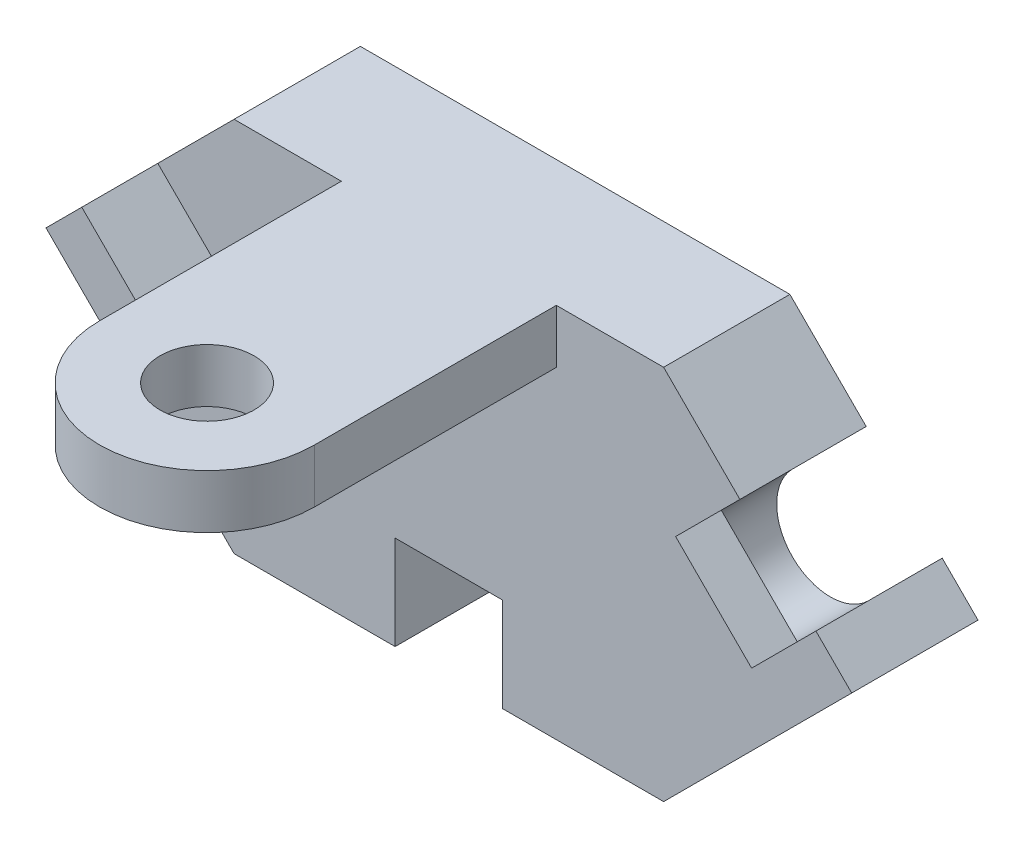
ISO-10303-21;
HEADER;
FILE_DESCRIPTION(('STEP AP214'),'2;1');
FILE_NAME('part.step','',(''),(''),'','','');
FILE_SCHEMA(('AUTOMOTIVE_DESIGN { 1 0 10303 214 1 1 1 1 }'));
ENDSEC;
DATA;
#1=APPLICATION_CONTEXT('core data for automotive mechanical design processes');
#2=APPLICATION_PROTOCOL_DEFINITION('international standard','automotive_design',2000,#1);
#3=PRODUCT_CONTEXT('',#1,'mechanical');
#4=PRODUCT('Part','Part','',(#3));
#5=PRODUCT_RELATED_PRODUCT_CATEGORY('part','',(#4));
#6=PRODUCT_DEFINITION_FORMATION('','',#4);
#7=PRODUCT_DEFINITION_CONTEXT('part definition',#1,'design');
#8=PRODUCT_DEFINITION('design','',#6,#7);
#9=PRODUCT_DEFINITION_SHAPE('','',#8);
#10=(LENGTH_UNIT() NAMED_UNIT(*) SI_UNIT(.MILLI.,.METRE.));
#11=(NAMED_UNIT(*) PLANE_ANGLE_UNIT() SI_UNIT($,.RADIAN.));
#12=(NAMED_UNIT(*) SI_UNIT($,.STERADIAN.) SOLID_ANGLE_UNIT());
#13=UNCERTAINTY_MEASURE_WITH_UNIT(LENGTH_MEASURE(1.E-05),#10,'distance_accuracy_value','');
#14=(GEOMETRIC_REPRESENTATION_CONTEXT(3) GLOBAL_UNCERTAINTY_ASSIGNED_CONTEXT((#13)) GLOBAL_UNIT_ASSIGNED_CONTEXT((#10,
#11,#12)) REPRESENTATION_CONTEXT('',''));
#15=CARTESIAN_POINT('',(0.,0.,0.));
#16=DIRECTION('',(0.,0.,1.));
#17=DIRECTION('',(1.,0.,0.));
#18=AXIS2_PLACEMENT_3D('',#15,#16,#17);
#19=CARTESIAN_POINT('',(7.99288091782957,7.,3.));
#20=DIRECTION('',(0.,-1.,0.));
#21=DIRECTION('',(0.,0.,-1.));
#22=AXIS2_PLACEMENT_3D('',#19,#20,#21);
#23=PLANE('',#22);
#24=DIRECTION('',(-1.,0.,0.));
#25=VECTOR('',#24,1.);
#26=CARTESIAN_POINT('',(7.99288091782957,7.,0.));
#27=LINE('',#26,#25);
#28=CARTESIAN_POINT('',(7.99288091782957,7.,0.));
#29=VERTEX_POINT('',#28);
#30=CARTESIAN_POINT('',(-7.99288091782957,7.,0.));
#31=VERTEX_POINT('',#30);
#32=EDGE_CURVE('E332',#29,#31,#27,.T.);
#33=ORIENTED_EDGE('',*,*,#32,.T.);
#34=DIRECTION('',(0.,0.,-1.));
#35=VECTOR('',#34,1.);
#36=CARTESIAN_POINT('',(-7.99288091782957,7.,3.));
#37=LINE('',#36,#35);
#38=CARTESIAN_POINT('',(-7.99288091782957,7.,4.7));
#39=VERTEX_POINT('',#38);
#40=EDGE_CURVE('E11',#39,#31,#37,.T.);
#41=ORIENTED_EDGE('',*,*,#40,.F.);
#42=DIRECTION('',(-1.,0.,0.));
#43=VECTOR('',#42,1.);
#44=CARTESIAN_POINT('',(7.99288091782957,7.,4.7));
#45=LINE('',#44,#43);
#46=CARTESIAN_POINT('',(-3.99999999999897,7.,4.7));
#47=VERTEX_POINT('',#46);
#48=EDGE_CURVE('E261',#47,#39,#45,.T.);
#49=ORIENTED_EDGE('',*,*,#48,.F.);
#50=DIRECTION('',(-2.29754487040507E-13,0.,1.));
#51=VECTOR('',#50,1.);
#52=CARTESIAN_POINT('',(-4.00000000000103,7.,13.6999999999991));
#53=LINE('',#52,#51);
#54=CARTESIAN_POINT('',(-4.,7.,13.6999999999991));
#55=VERTEX_POINT('',#54);
#56=EDGE_CURVE('E47',#47,#55,#53,.T.);
#57=ORIENTED_EDGE('',*,*,#56,.T.);
#58=CARTESIAN_POINT('',(0.,7.,13.7));
#59=DIRECTION('',(0.,1.,0.));
#60=DIRECTION('',(0.,0.,-1.));
#61=AXIS2_PLACEMENT_3D('',#58,#59,#60);
#62=CIRCLE('',#61,4.);
#63=CARTESIAN_POINT('',(3.99999999999897,7.,13.7));
#64=VERTEX_POINT('',#63);
#65=EDGE_CURVE('E224',#55,#64,#62,.T.);
#66=ORIENTED_EDGE('',*,*,#65,.T.);
#67=DIRECTION('',(2.30139981146256E-13,0.,-1.));
#68=VECTOR('',#67,1.);
#69=CARTESIAN_POINT('',(3.99999999999897,7.,13.7));
#70=LINE('',#69,#68);
#71=CARTESIAN_POINT('',(4.00000000000104,7.,4.7));
#72=VERTEX_POINT('',#71);
#73=EDGE_CURVE('E240',#64,#72,#70,.T.);
#74=ORIENTED_EDGE('',*,*,#73,.T.);
#75=CARTESIAN_POINT('',(7.99288091782957,7.,4.7));
#76=VERTEX_POINT('',#75);
#77=EDGE_CURVE('E263',#76,#72,#45,.T.);
#78=ORIENTED_EDGE('',*,*,#77,.F.);
#79=DIRECTION('',(0.,0.,-1.));
#80=VECTOR('',#79,1.);
#81=CARTESIAN_POINT('',(7.99288091782957,7.,3.));
#82=LINE('',#81,#80);
#83=EDGE_CURVE('E356',#76,#29,#82,.T.);
#84=ORIENTED_EDGE('',*,*,#83,.T.);
#85=EDGE_LOOP('',(#33,#41,#49,#57,#66,#74,#78,#84));
#86=FACE_BOUND('',#85,.T.);
#87=CARTESIAN_POINT('',(0.,7.,13.7));
#88=DIRECTION('',(0.,1.,0.));
#89=DIRECTION('',(0.,0.,-1.));
#90=AXIS2_PLACEMENT_3D('',#87,#88,#89);
#91=CIRCLE('',#90,1.75);
#92=CARTESIAN_POINT('',(0.,7.,11.95));
#93=VERTEX_POINT('',#92);
#94=EDGE_CURVE('E245',#93,#93,#91,.T.);
#95=ORIENTED_EDGE('',*,*,#94,.F.);
#96=EDGE_LOOP('',(#95));
#97=FACE_BOUND('',#96,.T.);
#98=ADVANCED_FACE('F33',(#86,#97),#23,.F.);
#99=CARTESIAN_POINT('',(-7.99288091782957,7.,3.));
#100=DIRECTION('',(0.707106781186548,-0.707106781186548,0.));
#101=DIRECTION('',(0.707106781186548,0.707106781186548,0.));
#102=AXIS2_PLACEMENT_3D('',#99,#100,#101);
#103=PLANE('',#102);
#104=DIRECTION('',(-0.707106781186547,-0.707106781186547,0.));
#105=VECTOR('',#104,1.);
#106=CARTESIAN_POINT('',(-7.99288091782957,7.,0.));
#107=LINE('',#106,#105);
#108=CARTESIAN_POINT('',(-10.8322268965417,4.16065402128788,0.));
#109=VERTEX_POINT('',#108);
#110=EDGE_CURVE('E359',#31,#109,#107,.T.);
#111=ORIENTED_EDGE('',*,*,#110,.T.);
#112=DIRECTION('',(0.,0.,-1.));
#113=VECTOR('',#112,1.);
#114=CARTESIAN_POINT('',(-10.8322268965417,4.16065402128788,3.));
#115=LINE('',#114,#113);
#116=CARTESIAN_POINT('',(-10.8322268965417,4.16065402128788,4.7));
#117=VERTEX_POINT('',#116);
#118=EDGE_CURVE('E40',#117,#109,#115,.T.);
#119=ORIENTED_EDGE('',*,*,#118,.F.);
#120=DIRECTION('',(-0.707106781186547,-0.707106781186547,0.));
#121=VECTOR('',#120,1.);
#122=CARTESIAN_POINT('',(-7.99288091782957,7.,4.7));
#123=LINE('',#122,#121);
#124=EDGE_CURVE('E266',#39,#117,#123,.T.);
#125=ORIENTED_EDGE('',*,*,#124,.F.);
#126=ORIENTED_EDGE('',*,*,#40,.T.);
#127=EDGE_LOOP('',(#111,#119,#125,#126));
#128=FACE_BOUND('',#127,.T.);
#129=ADVANCED_FACE('F472',(#128),#103,.F.);
#130=CARTESIAN_POINT('',(-8.0857864376269,1.41421356237309,3.));
#131=DIRECTION('',(0.707106781186548,0.707106781186548,0.));
#132=DIRECTION('',(-0.707106781186548,0.707106781186548,0.));
#133=AXIS2_PLACEMENT_3D('',#130,#131,#132);
#134=PLANE('',#133);
#135=DIRECTION('',(0.707106781186547,-0.707106781186547,0.));
#136=VECTOR('',#135,1.);
#137=CARTESIAN_POINT('',(-8.0857864376269,1.41421356237309,0.));
#138=LINE('',#137,#136);
#139=CARTESIAN_POINT('',(-8.0857864376269,1.41421356237309,0.));
#140=VERTEX_POINT('',#139);
#141=EDGE_CURVE('E361',#109,#140,#138,.T.);
#142=ORIENTED_EDGE('',*,*,#141,.T.);
#143=DIRECTION('',(0.,0.,-1.));
#144=VECTOR('',#143,1.);
#145=CARTESIAN_POINT('',(-8.0857864376269,1.41421356237309,3.));
#146=LINE('',#145,#144);
#147=CARTESIAN_POINT('',(-8.0857864376269,1.41421356237309,3.));
#148=VERTEX_POINT('',#147);
#149=EDGE_CURVE('E436',#148,#140,#146,.T.);
#150=ORIENTED_EDGE('',*,*,#149,.F.);
#151=DIRECTION('',(0.707106781186547,-0.707106781186547,0.));
#152=VECTOR('',#151,1.);
#153=CARTESIAN_POINT('',(-8.0857864376269,1.41421356237309,3.));
#154=LINE('',#153,#152);
#155=CARTESIAN_POINT('',(-8.43933982822018,1.76776695296637,3.));
#156=VERTEX_POINT('',#155);
#157=EDGE_CURVE('E333',#156,#148,#154,.T.);
#158=ORIENTED_EDGE('',*,*,#157,.F.);
#159=DIRECTION('',(0.,0.,-1.));
#160=VECTOR('',#159,1.);
#161=CARTESIAN_POINT('',(-8.43933982822018,1.76776695296637,4.7));
#162=LINE('',#161,#160);
#163=CARTESIAN_POINT('',(-8.43933982822018,1.76776695296637,4.7));
#164=VERTEX_POINT('',#163);
#165=EDGE_CURVE('E329',#164,#156,#162,.T.);
#166=ORIENTED_EDGE('',*,*,#165,.F.);
#167=DIRECTION('',(0.707106781186547,-0.707106781186548,0.));
#168=VECTOR('',#167,1.);
#169=CARTESIAN_POINT('',(-10.8322268965417,4.16065402128788,4.7));
#170=LINE('',#169,#168);
#171=EDGE_CURVE('E269',#117,#164,#170,.T.);
#172=ORIENTED_EDGE('',*,*,#171,.F.);
#173=ORIENTED_EDGE('',*,*,#118,.T.);
#174=EDGE_LOOP('',(#142,#150,#158,#166,#172,#173));
#175=FACE_BOUND('',#174,.T.);
#176=ADVANCED_FACE('F442',(#175),#134,.F.);
#177=CARTESIAN_POINT('',(-9.5,0.,3.));
#178=DIRECTION('',(0.,0.,-1.));
#179=DIRECTION('',(-1.,0.,0.));
#180=AXIS2_PLACEMENT_3D('',#177,#178,#179);
#181=CYLINDRICAL_SURFACE('',#180,2.);
#182=CARTESIAN_POINT('',(-9.5,0.,0.));
#183=DIRECTION('',(0.,0.,-1.));
#184=DIRECTION('',(1.,0.,0.));
#185=AXIS2_PLACEMENT_3D('',#182,#183,#184);
#186=CIRCLE('',#185,2.);
#187=CARTESIAN_POINT('',(-10.9142135623731,-1.41421356237309,0.));
#188=VERTEX_POINT('',#187);
#189=EDGE_CURVE('E363',#140,#188,#186,.T.);
#190=ORIENTED_EDGE('',*,*,#189,.T.);
#191=DIRECTION('',(0.,0.,-1.));
#192=VECTOR('',#191,1.);
#193=CARTESIAN_POINT('',(-10.9142135623731,-1.41421356237309,3.));
#194=LINE('',#193,#192);
#195=CARTESIAN_POINT('',(-10.9142135623731,-1.41421356237309,3.));
#196=VERTEX_POINT('',#195);
#197=EDGE_CURVE('E433',#196,#188,#194,.T.);
#198=ORIENTED_EDGE('',*,*,#197,.F.);
#199=CARTESIAN_POINT('',(-9.5,0.,3.));
#200=DIRECTION('',(0.,0.,-1.));
#201=DIRECTION('',(1.,0.,0.));
#202=AXIS2_PLACEMENT_3D('',#199,#200,#201);
#203=CIRCLE('',#202,2.);
#204=EDGE_CURVE('E336',#148,#196,#203,.T.);
#205=ORIENTED_EDGE('',*,*,#204,.F.);
#206=ORIENTED_EDGE('',*,*,#149,.T.);
#207=EDGE_LOOP('',(#190,#198,#205,#206));
#208=FACE_BOUND('',#207,.T.);
#209=ADVANCED_FACE('F453',(#208),#181,.F.);
#210=CARTESIAN_POINT('',(-10.9142135623731,-1.41421356237309,3.));
#211=DIRECTION('',(-0.707106781186548,-0.707106781186547,0.));
#212=DIRECTION('',(0.707106781186547,-0.707106781186548,0.));
#213=AXIS2_PLACEMENT_3D('',#210,#211,#212);
#214=PLANE('',#213);
#215=DIRECTION('',(-0.707106781186547,0.707106781186548,0.));
#216=VECTOR('',#215,1.);
#217=CARTESIAN_POINT('',(-10.9142135623731,-1.41421356237309,0.));
#218=LINE('',#217,#216);
#219=CARTESIAN_POINT('',(-13.6606540212879,1.33222689654169,0.));
#220=VERTEX_POINT('',#219);
#221=EDGE_CURVE('E365',#188,#220,#218,.T.);
#222=ORIENTED_EDGE('',*,*,#221,.T.);
#223=DIRECTION('',(0.,0.,-1.));
#224=VECTOR('',#223,1.);
#225=CARTESIAN_POINT('',(-13.6606540212879,1.33222689654169,3.));
#226=LINE('',#225,#224);
#227=CARTESIAN_POINT('',(-13.6606540212879,1.33222689654169,4.7));
#228=VERTEX_POINT('',#227);
#229=EDGE_CURVE('E430',#228,#220,#226,.T.);
#230=ORIENTED_EDGE('',*,*,#229,.F.);
#231=DIRECTION('',(-0.707106781186547,0.707106781186547,0.));
#232=VECTOR('',#231,1.);
#233=CARTESIAN_POINT('',(-11.2677669529664,-1.06066017177982,4.7));
#234=LINE('',#233,#232);
#235=CARTESIAN_POINT('',(-11.2677669529664,-1.06066017177982,4.7));
#236=VERTEX_POINT('',#235);
#237=EDGE_CURVE('E273',#236,#228,#234,.T.);
#238=ORIENTED_EDGE('',*,*,#237,.F.);
#239=DIRECTION('',(0.,0.,-1.));
#240=VECTOR('',#239,1.);
#241=CARTESIAN_POINT('',(-11.2677669529664,-1.06066017177982,4.7));
#242=LINE('',#241,#240);
#243=CARTESIAN_POINT('',(-11.2677669529664,-1.06066017177982,3.));
#244=VERTEX_POINT('',#243);
#245=EDGE_CURVE('E326',#236,#244,#242,.T.);
#246=ORIENTED_EDGE('',*,*,#245,.T.);
#247=DIRECTION('',(-0.707106781186547,0.707106781186548,0.));
#248=VECTOR('',#247,1.);
#249=CARTESIAN_POINT('',(-10.9142135623731,-1.41421356237309,3.));
#250=LINE('',#249,#248);
#251=EDGE_CURVE('E340',#196,#244,#250,.T.);
#252=ORIENTED_EDGE('',*,*,#251,.F.);
#253=ORIENTED_EDGE('',*,*,#197,.T.);
#254=EDGE_LOOP('',(#222,#230,#238,#246,#252,#253));
#255=FACE_BOUND('',#254,.T.);
#256=ADVANCED_FACE('F457',(#255),#214,.F.);
#257=CARTESIAN_POINT('',(-13.6606540212879,1.33222689654169,3.));
#258=DIRECTION('',(0.707106781186547,-0.707106781186548,0.));
#259=DIRECTION('',(0.707106781186548,0.707106781186547,0.));
#260=AXIS2_PLACEMENT_3D('',#257,#258,#259);
#261=PLANE('',#260);
#262=DIRECTION('',(-0.707106781186548,-0.707106781186547,0.));
#263=VECTOR('',#262,1.);
#264=CARTESIAN_POINT('',(-13.6606540212879,1.33222689654169,0.));
#265=LINE('',#264,#263);
#266=CARTESIAN_POINT('',(-14.9928809178296,0.,0.));
#267=VERTEX_POINT('',#266);
#268=EDGE_CURVE('E367',#220,#267,#265,.T.);
#269=ORIENTED_EDGE('',*,*,#268,.T.);
#270=DIRECTION('',(0.,0.,-1.));
#271=VECTOR('',#270,1.);
#272=CARTESIAN_POINT('',(-14.9928809178296,0.,3.));
#273=LINE('',#272,#271);
#274=CARTESIAN_POINT('',(-14.9928809178296,0.,4.7));
#275=VERTEX_POINT('',#274);
#276=EDGE_CURVE('E427',#275,#267,#273,.T.);
#277=ORIENTED_EDGE('',*,*,#276,.F.);
#278=DIRECTION('',(-0.707106781186548,-0.707106781186547,0.));
#279=VECTOR('',#278,1.);
#280=CARTESIAN_POINT('',(-13.6606540212879,1.33222689654169,4.7));
#281=LINE('',#280,#279);
#282=EDGE_CURVE('E276',#228,#275,#281,.T.);
#283=ORIENTED_EDGE('',*,*,#282,.F.);
#284=ORIENTED_EDGE('',*,*,#229,.T.);
#285=EDGE_LOOP('',(#269,#277,#283,#284));
#286=FACE_BOUND('',#285,.T.);
#287=ADVANCED_FACE('F540',(#286),#261,.F.);
#288=CARTESIAN_POINT('',(-14.9928809178296,0.,3.));
#289=DIRECTION('',(0.707106781186548,0.707106781186548,0.));
#290=DIRECTION('',(-0.707106781186548,0.707106781186548,0.));
#291=AXIS2_PLACEMENT_3D('',#288,#289,#290);
#292=PLANE('',#291);
#293=DIRECTION('',(0.707106781186547,-0.707106781186547,0.));
#294=VECTOR('',#293,1.);
#295=CARTESIAN_POINT('',(-14.9928809178296,0.,0.));
#296=LINE('',#295,#294);
#297=CARTESIAN_POINT('',(-7.99288091782957,-7.,0.));
#298=VERTEX_POINT('',#297);
#299=EDGE_CURVE('E369',#267,#298,#296,.T.);
#300=ORIENTED_EDGE('',*,*,#299,.T.);
#301=DIRECTION('',(0.,0.,-1.));
#302=VECTOR('',#301,1.);
#303=CARTESIAN_POINT('',(-7.99288091782957,-7.,3.));
#304=LINE('',#303,#302);
#305=CARTESIAN_POINT('',(-7.99288091782957,-7.,4.7));
#306=VERTEX_POINT('',#305);
#307=EDGE_CURVE('E424',#306,#298,#304,.T.);
#308=ORIENTED_EDGE('',*,*,#307,.F.);
#309=DIRECTION('',(0.707106781186547,-0.707106781186547,0.));
#310=VECTOR('',#309,1.);
#311=CARTESIAN_POINT('',(-14.9928809178296,0.,4.7));
#312=LINE('',#311,#310);
#313=EDGE_CURVE('E279',#275,#306,#312,.T.);
#314=ORIENTED_EDGE('',*,*,#313,.F.);
#315=ORIENTED_EDGE('',*,*,#276,.T.);
#316=EDGE_LOOP('',(#300,#308,#314,#315));
#317=FACE_BOUND('',#316,.T.);
#318=ADVANCED_FACE('F538',(#317),#292,.F.);
#319=CARTESIAN_POINT('',(-7.99288091782957,-7.,3.));
#320=DIRECTION('',(0.,1.,0.));
#321=DIRECTION('',(0.,0.,1.));
#322=AXIS2_PLACEMENT_3D('',#319,#320,#321);
#323=PLANE('',#322);
#324=DIRECTION('',(1.,0.,0.));
#325=VECTOR('',#324,1.);
#326=CARTESIAN_POINT('',(-7.99288091782957,-7.,0.));
#327=LINE('',#326,#325);
#328=CARTESIAN_POINT('',(-2.,-7.,0.));
#329=VERTEX_POINT('',#328);
#330=EDGE_CURVE('E371',#298,#329,#327,.T.);
#331=ORIENTED_EDGE('',*,*,#330,.T.);
#332=DIRECTION('',(0.,0.,-1.));
#333=VECTOR('',#332,1.);
#334=CARTESIAN_POINT('',(-2.,-7.,3.));
#335=LINE('',#334,#333);
#336=CARTESIAN_POINT('',(-2.,-7.,4.7));
#337=VERTEX_POINT('',#336);
#338=EDGE_CURVE('E421',#337,#329,#335,.T.);
#339=ORIENTED_EDGE('',*,*,#338,.F.);
#340=DIRECTION('',(1.,0.,0.));
#341=VECTOR('',#340,1.);
#342=CARTESIAN_POINT('',(-7.99288091782957,-7.,4.7));
#343=LINE('',#342,#341);
#344=EDGE_CURVE('E282',#306,#337,#343,.T.);
#345=ORIENTED_EDGE('',*,*,#344,.F.);
#346=ORIENTED_EDGE('',*,*,#307,.T.);
#347=EDGE_LOOP('',(#331,#339,#345,#346));
#348=FACE_BOUND('',#347,.T.);
#349=ADVANCED_FACE('F535',(#348),#323,.F.);
#350=CARTESIAN_POINT('',(-2.,-3.,3.));
#351=DIRECTION('',(-1.,0.,0.));
#352=DIRECTION('',(0.,-1.,0.));
#353=AXIS2_PLACEMENT_3D('',#350,#351,#352);
#354=PLANE('',#353);
#355=DIRECTION('',(0.,1.,0.));
#356=VECTOR('',#355,1.);
#357=CARTESIAN_POINT('',(-2.,-3.,0.));
#358=LINE('',#357,#356);
#359=CARTESIAN_POINT('',(-2.,-3.,0.));
#360=VERTEX_POINT('',#359);
#361=EDGE_CURVE('E373',#329,#360,#358,.T.);
#362=ORIENTED_EDGE('',*,*,#361,.T.);
#363=DIRECTION('',(0.,0.,-1.));
#364=VECTOR('',#363,1.);
#365=CARTESIAN_POINT('',(-2.,-3.,3.));
#366=LINE('',#365,#364);
#367=CARTESIAN_POINT('',(-2.,-3.,3.));
#368=VERTEX_POINT('',#367);
#369=EDGE_CURVE('E418',#368,#360,#366,.T.);
#370=ORIENTED_EDGE('',*,*,#369,.F.);
#371=DIRECTION('',(0.,1.,0.));
#372=VECTOR('',#371,1.);
#373=CARTESIAN_POINT('',(-2.,-3.,3.));
#374=LINE('',#373,#372);
#375=CARTESIAN_POINT('',(-2.,-3.5,3.));
#376=VERTEX_POINT('',#375);
#377=EDGE_CURVE('E342',#376,#368,#374,.T.);
#378=ORIENTED_EDGE('',*,*,#377,.F.);
#379=DIRECTION('',(0.,0.,-1.));
#380=VECTOR('',#379,1.);
#381=CARTESIAN_POINT('',(-2.,-3.5,4.7));
#382=LINE('',#381,#380);
#383=CARTESIAN_POINT('',(-2.,-3.5,4.7));
#384=VERTEX_POINT('',#383);
#385=EDGE_CURVE('E323',#384,#376,#382,.T.);
#386=ORIENTED_EDGE('',*,*,#385,.F.);
#387=DIRECTION('',(0.,1.,0.));
#388=VECTOR('',#387,1.);
#389=CARTESIAN_POINT('',(-2.,-7.,4.7));
#390=LINE('',#389,#388);
#391=EDGE_CURVE('E285',#337,#384,#390,.T.);
#392=ORIENTED_EDGE('',*,*,#391,.F.);
#393=ORIENTED_EDGE('',*,*,#338,.T.);
#394=EDGE_LOOP('',(#362,#370,#378,#386,#392,#393));
#395=FACE_BOUND('',#394,.T.);
#396=ADVANCED_FACE('F532',(#395),#354,.F.);
#397=CARTESIAN_POINT('',(0.,-3.,3.));
#398=DIRECTION('',(0.,0.,-1.));
#399=DIRECTION('',(-1.,0.,0.));
#400=AXIS2_PLACEMENT_3D('',#397,#398,#399);
#401=CYLINDRICAL_SURFACE('',#400,2.);
#402=CARTESIAN_POINT('',(0.,-3.,0.));
#403=DIRECTION('',(0.,0.,-1.));
#404=DIRECTION('',(1.,0.,0.));
#405=AXIS2_PLACEMENT_3D('',#402,#403,#404);
#406=CIRCLE('',#405,2.);
#407=CARTESIAN_POINT('',(2.,-3.,0.));
#408=VERTEX_POINT('',#407);
#409=EDGE_CURVE('E375',#360,#408,#406,.T.);
#410=ORIENTED_EDGE('',*,*,#409,.T.);
#411=DIRECTION('',(0.,0.,-1.));
#412=VECTOR('',#411,1.);
#413=CARTESIAN_POINT('',(2.,-3.,3.));
#414=LINE('',#413,#412);
#415=CARTESIAN_POINT('',(2.,-3.,3.));
#416=VERTEX_POINT('',#415);
#417=EDGE_CURVE('E415',#416,#408,#414,.T.);
#418=ORIENTED_EDGE('',*,*,#417,.F.);
#419=CARTESIAN_POINT('',(0.,-3.,3.));
#420=DIRECTION('',(0.,0.,-1.));
#421=DIRECTION('',(1.,0.,0.));
#422=AXIS2_PLACEMENT_3D('',#419,#420,#421);
#423=CIRCLE('',#422,2.);
#424=EDGE_CURVE('E345',#368,#416,#423,.T.);
#425=ORIENTED_EDGE('',*,*,#424,.F.);
#426=ORIENTED_EDGE('',*,*,#369,.T.);
#427=EDGE_LOOP('',(#410,#418,#425,#426));
#428=FACE_BOUND('',#427,.T.);
#429=ADVANCED_FACE('F527',(#428),#401,.F.);
#430=CARTESIAN_POINT('',(2.,-3.,3.));
#431=DIRECTION('',(1.,0.,0.));
#432=DIRECTION('',(0.,1.,0.));
#433=AXIS2_PLACEMENT_3D('',#430,#431,#432);
#434=PLANE('',#433);
#435=DIRECTION('',(0.,-1.,0.));
#436=VECTOR('',#435,1.);
#437=CARTESIAN_POINT('',(2.,-3.,0.));
#438=LINE('',#437,#436);
#439=CARTESIAN_POINT('',(2.,-7.,0.));
#440=VERTEX_POINT('',#439);
#441=EDGE_CURVE('E377',#408,#440,#438,.T.);
#442=ORIENTED_EDGE('',*,*,#441,.T.);
#443=DIRECTION('',(0.,0.,-1.));
#444=VECTOR('',#443,1.);
#445=CARTESIAN_POINT('',(2.,-7.,3.));
#446=LINE('',#445,#444);
#447=CARTESIAN_POINT('',(2.,-7.,4.7));
#448=VERTEX_POINT('',#447);
#449=EDGE_CURVE('E412',#448,#440,#446,.T.);
#450=ORIENTED_EDGE('',*,*,#449,.F.);
#451=DIRECTION('',(0.,-1.,0.));
#452=VECTOR('',#451,1.);
#453=CARTESIAN_POINT('',(2.,-3.5,4.7));
#454=LINE('',#453,#452);
#455=CARTESIAN_POINT('',(2.,-3.5,4.7));
#456=VERTEX_POINT('',#455);
#457=EDGE_CURVE('E289',#456,#448,#454,.T.);
#458=ORIENTED_EDGE('',*,*,#457,.F.);
#459=DIRECTION('',(0.,0.,-1.));
#460=VECTOR('',#459,1.);
#461=CARTESIAN_POINT('',(2.,-3.5,4.7));
#462=LINE('',#461,#460);
#463=CARTESIAN_POINT('',(2.,-3.5,3.));
#464=VERTEX_POINT('',#463);
#465=EDGE_CURVE('E320',#456,#464,#462,.T.);
#466=ORIENTED_EDGE('',*,*,#465,.T.);
#467=DIRECTION('',(0.,-1.,0.));
#468=VECTOR('',#467,1.);
#469=CARTESIAN_POINT('',(2.,-3.,3.));
#470=LINE('',#469,#468);
#471=EDGE_CURVE('E348',#416,#464,#470,.T.);
#472=ORIENTED_EDGE('',*,*,#471,.F.);
#473=ORIENTED_EDGE('',*,*,#417,.T.);
#474=EDGE_LOOP('',(#442,#450,#458,#466,#472,#473));
#475=FACE_BOUND('',#474,.T.);
#476=ADVANCED_FACE('F514',(#475),#434,.F.);
#477=CARTESIAN_POINT('',(2.,-7.,3.));
#478=DIRECTION('',(0.,1.,0.));
#479=DIRECTION('',(0.,0.,1.));
#480=AXIS2_PLACEMENT_3D('',#477,#478,#479);
#481=PLANE('',#480);
#482=DIRECTION('',(1.,0.,0.));
#483=VECTOR('',#482,1.);
#484=CARTESIAN_POINT('',(2.,-7.,0.));
#485=LINE('',#484,#483);
#486=CARTESIAN_POINT('',(7.99288091782957,-7.,0.));
#487=VERTEX_POINT('',#486);
#488=EDGE_CURVE('E379',#440,#487,#485,.T.);
#489=ORIENTED_EDGE('',*,*,#488,.T.);
#490=DIRECTION('',(0.,0.,-1.));
#491=VECTOR('',#490,1.);
#492=CARTESIAN_POINT('',(7.99288091782957,-7.,3.));
#493=LINE('',#492,#491);
#494=CARTESIAN_POINT('',(7.99288091782957,-7.,4.7));
#495=VERTEX_POINT('',#494);
#496=EDGE_CURVE('E409',#495,#487,#493,.T.);
#497=ORIENTED_EDGE('',*,*,#496,.F.);
#498=DIRECTION('',(1.,0.,0.));
#499=VECTOR('',#498,1.);
#500=CARTESIAN_POINT('',(2.,-7.,4.7));
#501=LINE('',#500,#499);
#502=EDGE_CURVE('E292',#448,#495,#501,.T.);
#503=ORIENTED_EDGE('',*,*,#502,.F.);
#504=ORIENTED_EDGE('',*,*,#449,.T.);
#505=EDGE_LOOP('',(#489,#497,#503,#504));
#506=FACE_BOUND('',#505,.T.);
#507=ADVANCED_FACE('F511',(#506),#481,.F.);
#508=CARTESIAN_POINT('',(7.99288091782957,-7.,3.));
#509=DIRECTION('',(-0.707106781186548,0.707106781186547,0.));
#510=DIRECTION('',(-0.707106781186547,-0.707106781186548,0.));
#511=AXIS2_PLACEMENT_3D('',#508,#509,#510);
#512=PLANE('',#511);
#513=DIRECTION('',(0.707106781186547,0.707106781186548,0.));
#514=VECTOR('',#513,1.);
#515=CARTESIAN_POINT('',(7.99288091782957,-7.,0.));
#516=LINE('',#515,#514);
#517=CARTESIAN_POINT('',(14.9928809178296,0.,0.));
#518=VERTEX_POINT('',#517);
#519=EDGE_CURVE('E381',#487,#518,#516,.T.);
#520=ORIENTED_EDGE('',*,*,#519,.T.);
#521=DIRECTION('',(0.,0.,-1.));
#522=VECTOR('',#521,1.);
#523=CARTESIAN_POINT('',(14.9928809178296,0.,3.));
#524=LINE('',#523,#522);
#525=CARTESIAN_POINT('',(14.9928809178296,0.,4.7));
#526=VERTEX_POINT('',#525);
#527=EDGE_CURVE('E406',#526,#518,#524,.T.);
#528=ORIENTED_EDGE('',*,*,#527,.F.);
#529=DIRECTION('',(0.707106781186547,0.707106781186548,0.));
#530=VECTOR('',#529,1.);
#531=CARTESIAN_POINT('',(7.99288091782957,-7.,4.7));
#532=LINE('',#531,#530);
#533=EDGE_CURVE('E295',#495,#526,#532,.T.);
#534=ORIENTED_EDGE('',*,*,#533,.F.);
#535=ORIENTED_EDGE('',*,*,#496,.T.);
#536=EDGE_LOOP('',(#520,#528,#534,#535));
#537=FACE_BOUND('',#536,.T.);
#538=ADVANCED_FACE('F506',(#537),#512,.F.);
#539=CARTESIAN_POINT('',(14.9928809178296,0.,3.));
#540=DIRECTION('',(-0.707106781186547,-0.707106781186548,0.));
#541=DIRECTION('',(0.707106781186548,-0.707106781186547,0.));
#542=AXIS2_PLACEMENT_3D('',#539,#540,#541);
#543=PLANE('',#542);
#544=DIRECTION('',(-0.707106781186548,0.707106781186547,0.));
#545=VECTOR('',#544,1.);
#546=CARTESIAN_POINT('',(14.9928809178296,0.,0.));
#547=LINE('',#546,#545);
#548=CARTESIAN_POINT('',(13.6606540212879,1.33222689654169,0.));
#549=VERTEX_POINT('',#548);
#550=EDGE_CURVE('E383',#518,#549,#547,.T.);
#551=ORIENTED_EDGE('',*,*,#550,.T.);
#552=DIRECTION('',(0.,0.,-1.));
#553=VECTOR('',#552,1.);
#554=CARTESIAN_POINT('',(13.6606540212879,1.33222689654169,3.));
#555=LINE('',#554,#553);
#556=CARTESIAN_POINT('',(13.6606540212879,1.33222689654169,4.7));
#557=VERTEX_POINT('',#556);
#558=EDGE_CURVE('E403',#557,#549,#555,.T.);
#559=ORIENTED_EDGE('',*,*,#558,.F.);
#560=DIRECTION('',(-0.707106781186548,0.707106781186547,0.));
#561=VECTOR('',#560,1.);
#562=CARTESIAN_POINT('',(14.9928809178296,0.,4.7));
#563=LINE('',#562,#561);
#564=EDGE_CURVE('E298',#526,#557,#563,.T.);
#565=ORIENTED_EDGE('',*,*,#564,.F.);
#566=ORIENTED_EDGE('',*,*,#527,.T.);
#567=EDGE_LOOP('',(#551,#559,#565,#566));
#568=FACE_BOUND('',#567,.T.);
#569=ADVANCED_FACE('F502',(#568),#543,.F.);
#570=CARTESIAN_POINT('',(10.9142135623731,-1.41421356237309,3.));
#571=DIRECTION('',(0.707106781186548,-0.707106781186547,0.));
#572=DIRECTION('',(0.707106781186547,0.707106781186548,0.));
#573=AXIS2_PLACEMENT_3D('',#570,#571,#572);
#574=PLANE('',#573);
#575=DIRECTION('',(-0.707106781186547,-0.707106781186548,0.));
#576=VECTOR('',#575,1.);
#577=CARTESIAN_POINT('',(10.9142135623731,-1.41421356237309,0.));
#578=LINE('',#577,#576);
#579=CARTESIAN_POINT('',(10.9142135623731,-1.41421356237309,0.));
#580=VERTEX_POINT('',#579);
#581=EDGE_CURVE('E385',#549,#580,#578,.T.);
#582=ORIENTED_EDGE('',*,*,#581,.T.);
#583=DIRECTION('',(0.,0.,-1.));
#584=VECTOR('',#583,1.);
#585=CARTESIAN_POINT('',(10.9142135623731,-1.41421356237309,3.));
#586=LINE('',#585,#584);
#587=CARTESIAN_POINT('',(10.9142135623731,-1.41421356237309,3.));
#588=VERTEX_POINT('',#587);
#589=EDGE_CURVE('E400',#588,#580,#586,.T.);
#590=ORIENTED_EDGE('',*,*,#589,.F.);
#591=DIRECTION('',(-0.707106781186547,-0.707106781186548,0.));
#592=VECTOR('',#591,1.);
#593=CARTESIAN_POINT('',(10.9142135623731,-1.41421356237309,3.));
#594=LINE('',#593,#592);
#595=CARTESIAN_POINT('',(11.2677669529664,-1.06066017177982,3.));
#596=VERTEX_POINT('',#595);
#597=EDGE_CURVE('E350',#596,#588,#594,.T.);
#598=ORIENTED_EDGE('',*,*,#597,.F.);
#599=DIRECTION('',(0.,0.,-1.));
#600=VECTOR('',#599,1.);
#601=CARTESIAN_POINT('',(11.2677669529664,-1.06066017177982,4.7));
#602=LINE('',#601,#600);
#603=CARTESIAN_POINT('',(11.2677669529664,-1.06066017177982,4.7));
#604=VERTEX_POINT('',#603);
#605=EDGE_CURVE('E317',#604,#596,#602,.T.);
#606=ORIENTED_EDGE('',*,*,#605,.F.);
#607=DIRECTION('',(-0.707106781186547,-0.707106781186548,0.));
#608=VECTOR('',#607,1.);
#609=CARTESIAN_POINT('',(11.2677669529664,-1.06066017177982,4.7));
#610=LINE('',#609,#608);
#611=EDGE_CURVE('E301',#557,#604,#610,.T.);
#612=ORIENTED_EDGE('',*,*,#611,.F.);
#613=ORIENTED_EDGE('',*,*,#558,.T.);
#614=EDGE_LOOP('',(#582,#590,#598,#606,#612,#613));
#615=FACE_BOUND('',#614,.T.);
#616=ADVANCED_FACE('F499',(#615),#574,.F.);
#617=CARTESIAN_POINT('',(9.5,0.,3.));
#618=DIRECTION('',(0.,0.,-1.));
#619=DIRECTION('',(-1.,0.,0.));
#620=AXIS2_PLACEMENT_3D('',#617,#618,#619);
#621=CYLINDRICAL_SURFACE('',#620,2.);
#622=CARTESIAN_POINT('',(9.5,0.,0.));
#623=DIRECTION('',(0.,0.,-1.));
#624=DIRECTION('',(1.,0.,0.));
#625=AXIS2_PLACEMENT_3D('',#622,#623,#624);
#626=CIRCLE('',#625,2.);
#627=CARTESIAN_POINT('',(8.0857864376269,1.4142135623731,0.));
#628=VERTEX_POINT('',#627);
#629=EDGE_CURVE('E387',#580,#628,#626,.T.);
#630=ORIENTED_EDGE('',*,*,#629,.T.);
#631=DIRECTION('',(0.,0.,-1.));
#632=VECTOR('',#631,1.);
#633=CARTESIAN_POINT('',(8.0857864376269,1.4142135623731,3.));
#634=LINE('',#633,#632);
#635=CARTESIAN_POINT('',(8.0857864376269,1.4142135623731,3.));
#636=VERTEX_POINT('',#635);
#637=EDGE_CURVE('E397',#636,#628,#634,.T.);
#638=ORIENTED_EDGE('',*,*,#637,.F.);
#639=CARTESIAN_POINT('',(9.5,0.,3.));
#640=DIRECTION('',(0.,0.,-1.));
#641=DIRECTION('',(1.,0.,0.));
#642=AXIS2_PLACEMENT_3D('',#639,#640,#641);
#643=CIRCLE('',#642,2.);
#644=EDGE_CURVE('E353',#588,#636,#643,.T.);
#645=ORIENTED_EDGE('',*,*,#644,.F.);
#646=ORIENTED_EDGE('',*,*,#589,.T.);
#647=EDGE_LOOP('',(#630,#638,#645,#646));
#648=FACE_BOUND('',#647,.T.);
#649=ADVANCED_FACE('F494',(#648),#621,.F.);
#650=CARTESIAN_POINT('',(8.0857864376269,1.4142135623731,3.));
#651=DIRECTION('',(-0.707106781186548,0.707106781186547,0.));
#652=DIRECTION('',(-0.707106781186547,-0.707106781186548,0.));
#653=AXIS2_PLACEMENT_3D('',#650,#651,#652);
#654=PLANE('',#653);
#655=DIRECTION('',(0.707106781186547,0.707106781186548,0.));
#656=VECTOR('',#655,1.);
#657=CARTESIAN_POINT('',(8.0857864376269,1.4142135623731,0.));
#658=LINE('',#657,#656);
#659=CARTESIAN_POINT('',(10.8322268965417,4.16065402128788,0.));
#660=VERTEX_POINT('',#659);
#661=EDGE_CURVE('E389',#628,#660,#658,.T.);
#662=ORIENTED_EDGE('',*,*,#661,.T.);
#663=DIRECTION('',(0.,0.,-1.));
#664=VECTOR('',#663,1.);
#665=CARTESIAN_POINT('',(10.8322268965417,4.16065402128788,3.));
#666=LINE('',#665,#664);
#667=CARTESIAN_POINT('',(10.8322268965417,4.16065402128788,4.7));
#668=VERTEX_POINT('',#667);
#669=EDGE_CURVE('E394',#668,#660,#666,.T.);
#670=ORIENTED_EDGE('',*,*,#669,.F.);
#671=DIRECTION('',(0.707106781186547,0.707106781186548,0.));
#672=VECTOR('',#671,1.);
#673=CARTESIAN_POINT('',(10.8322268965417,4.16065402128788,4.7));
#674=LINE('',#673,#672);
#675=CARTESIAN_POINT('',(8.43933982822018,1.76776695296637,4.7));
#676=VERTEX_POINT('',#675);
#677=EDGE_CURVE('E305',#676,#668,#674,.T.);
#678=ORIENTED_EDGE('',*,*,#677,.F.);
#679=DIRECTION('',(0.,0.,-1.));
#680=VECTOR('',#679,1.);
#681=CARTESIAN_POINT('',(8.43933982822018,1.76776695296637,4.7));
#682=LINE('',#681,#680);
#683=CARTESIAN_POINT('',(8.43933982822018,1.76776695296637,3.));
#684=VERTEX_POINT('',#683);
#685=EDGE_CURVE('E308',#676,#684,#682,.T.);
#686=ORIENTED_EDGE('',*,*,#685,.T.);
#687=DIRECTION('',(0.707106781186547,0.707106781186548,0.));
#688=VECTOR('',#687,1.);
#689=CARTESIAN_POINT('',(8.0857864376269,1.4142135623731,3.));
#690=LINE('',#689,#688);
#691=EDGE_CURVE('E55',#636,#684,#690,.T.);
#692=ORIENTED_EDGE('',*,*,#691,.F.);
#693=ORIENTED_EDGE('',*,*,#637,.T.);
#694=EDGE_LOOP('',(#662,#670,#678,#686,#692,#693));
#695=FACE_BOUND('',#694,.T.);
#696=ADVANCED_FACE('F484',(#695),#654,.F.);
#697=CARTESIAN_POINT('',(10.8322268965417,4.16065402128788,3.));
#698=DIRECTION('',(-0.707106781186547,-0.707106781186548,0.));
#699=DIRECTION('',(0.707106781186548,-0.707106781186547,0.));
#700=AXIS2_PLACEMENT_3D('',#697,#698,#699);
#701=PLANE('',#700);
#702=DIRECTION('',(-0.707106781186548,0.707106781186547,0.));
#703=VECTOR('',#702,1.);
#704=CARTESIAN_POINT('',(10.8322268965417,4.16065402128788,0.));
#705=LINE('',#704,#703);
#706=EDGE_CURVE('E337',#660,#29,#705,.T.);
#707=ORIENTED_EDGE('',*,*,#706,.T.);
#708=ORIENTED_EDGE('',*,*,#83,.F.);
#709=DIRECTION('',(-0.707106781186548,0.707106781186547,0.));
#710=VECTOR('',#709,1.);
#711=CARTESIAN_POINT('',(10.8322268965417,4.16065402128788,4.7));
#712=LINE('',#711,#710);
#713=EDGE_CURVE('E258',#668,#76,#712,.T.);
#714=ORIENTED_EDGE('',*,*,#713,.F.);
#715=ORIENTED_EDGE('',*,*,#669,.T.);
#716=EDGE_LOOP('',(#707,#708,#714,#715));
#717=FACE_BOUND('',#716,.T.);
#718=ADVANCED_FACE('F480',(#717),#701,.F.);
#719=CARTESIAN_POINT('',(-9.5,0.,0.));
#720=DIRECTION('',(0.,0.,1.));
#721=DIRECTION('',(1.,0.,0.));
#722=AXIS2_PLACEMENT_3D('',#719,#720,#721);
#723=PLANE('',#722);
#724=ORIENTED_EDGE('',*,*,#32,.F.);
#725=ORIENTED_EDGE('',*,*,#706,.F.);
#726=ORIENTED_EDGE('',*,*,#661,.F.);
#727=ORIENTED_EDGE('',*,*,#629,.F.);
#728=ORIENTED_EDGE('',*,*,#581,.F.);
#729=ORIENTED_EDGE('',*,*,#550,.F.);
#730=ORIENTED_EDGE('',*,*,#519,.F.);
#731=ORIENTED_EDGE('',*,*,#488,.F.);
#732=ORIENTED_EDGE('',*,*,#441,.F.);
#733=ORIENTED_EDGE('',*,*,#409,.F.);
#734=ORIENTED_EDGE('',*,*,#361,.F.);
#735=ORIENTED_EDGE('',*,*,#330,.F.);
#736=ORIENTED_EDGE('',*,*,#299,.F.);
#737=ORIENTED_EDGE('',*,*,#268,.F.);
#738=ORIENTED_EDGE('',*,*,#221,.F.);
#739=ORIENTED_EDGE('',*,*,#189,.F.);
#740=ORIENTED_EDGE('',*,*,#141,.F.);
#741=ORIENTED_EDGE('',*,*,#110,.F.);
#742=EDGE_LOOP('',(#724,#725,#726,#727,#728,#729,#730,#731,#732,#733,#734,#735,#736,#737,#738,
#739,#740,#741));
#743=FACE_BOUND('',#742,.T.);
#744=ADVANCED_FACE('F449',(#743),#723,.F.);
#745=CARTESIAN_POINT('',(0.,0.,3.));
#746=DIRECTION('',(0.,0.,1.));
#747=DIRECTION('',(1.,0.,0.));
#748=AXIS2_PLACEMENT_3D('',#745,#746,#747);
#749=PLANE('',#748);
#750=DIRECTION('',(-0.707106781186548,-0.707106781186547,0.));
#751=VECTOR('',#750,1.);
#752=CARTESIAN_POINT('',(-11.2677669529664,-1.06066017177982,3.));
#753=LINE('',#752,#751);
#754=EDGE_CURVE('E254',#156,#244,#753,.T.);
#755=ORIENTED_EDGE('',*,*,#754,.F.);
#756=ORIENTED_EDGE('',*,*,#157,.T.);
#757=ORIENTED_EDGE('',*,*,#204,.T.);
#758=ORIENTED_EDGE('',*,*,#251,.T.);
#759=EDGE_LOOP('',(#755,#756,#757,#758));
#760=FACE_BOUND('',#759,.T.);
#761=ADVANCED_FACE('F462',(#760),#749,.F.);
#762=DIRECTION('',(1.,0.,0.));
#763=VECTOR('',#762,1.);
#764=CARTESIAN_POINT('',(2.,-3.5,3.));
#765=LINE('',#764,#763);
#766=EDGE_CURVE('E311',#376,#464,#765,.T.);
#767=ORIENTED_EDGE('',*,*,#766,.F.);
#768=ORIENTED_EDGE('',*,*,#377,.T.);
#769=ORIENTED_EDGE('',*,*,#424,.T.);
#770=ORIENTED_EDGE('',*,*,#471,.T.);
#771=EDGE_LOOP('',(#767,#768,#769,#770));
#772=FACE_BOUND('',#771,.T.);
#773=ADVANCED_FACE('F525',(#772),#749,.F.);
#774=DIRECTION('',(-0.707106781186548,0.707106781186547,0.));
#775=VECTOR('',#774,1.);
#776=CARTESIAN_POINT('',(11.2677669529664,-1.06066017177982,3.));
#777=LINE('',#776,#775);
#778=EDGE_CURVE('E262',#596,#684,#777,.T.);
#779=ORIENTED_EDGE('',*,*,#778,.F.);
#780=ORIENTED_EDGE('',*,*,#597,.T.);
#781=ORIENTED_EDGE('',*,*,#644,.T.);
#782=ORIENTED_EDGE('',*,*,#691,.T.);
#783=EDGE_LOOP('',(#779,#780,#781,#782));
#784=FACE_BOUND('',#783,.T.);
#785=ADVANCED_FACE('F492',(#784),#749,.F.);
#786=CARTESIAN_POINT('',(-11.2677669529664,-1.06066017177982,4.7));
#787=DIRECTION('',(0.707106781186547,-0.707106781186548,0.));
#788=DIRECTION('',(0.707106781186548,0.707106781186547,0.));
#789=AXIS2_PLACEMENT_3D('',#786,#787,#788);
#790=PLANE('',#789);
#791=ORIENTED_EDGE('',*,*,#754,.T.);
#792=ORIENTED_EDGE('',*,*,#245,.F.);
#793=DIRECTION('',(-0.707106781186548,-0.707106781186547,0.));
#794=VECTOR('',#793,1.);
#795=CARTESIAN_POINT('',(-11.2677669529664,-1.06066017177982,4.7));
#796=LINE('',#795,#794);
#797=EDGE_CURVE('E271',#164,#236,#796,.T.);
#798=ORIENTED_EDGE('',*,*,#797,.F.);
#799=ORIENTED_EDGE('',*,*,#165,.T.);
#800=EDGE_LOOP('',(#791,#792,#798,#799));
#801=FACE_BOUND('',#800,.T.);
#802=ADVANCED_FACE('F465',(#801),#790,.F.);
#803=CARTESIAN_POINT('',(2.,-3.5,4.7));
#804=DIRECTION('',(0.,1.,0.));
#805=DIRECTION('',(0.,0.,1.));
#806=AXIS2_PLACEMENT_3D('',#803,#804,#805);
#807=PLANE('',#806);
#808=ORIENTED_EDGE('',*,*,#766,.T.);
#809=ORIENTED_EDGE('',*,*,#465,.F.);
#810=DIRECTION('',(1.,0.,0.));
#811=VECTOR('',#810,1.);
#812=CARTESIAN_POINT('',(2.,-3.5,4.7));
#813=LINE('',#812,#811);
#814=EDGE_CURVE('E287',#384,#456,#813,.T.);
#815=ORIENTED_EDGE('',*,*,#814,.F.);
#816=ORIENTED_EDGE('',*,*,#385,.T.);
#817=EDGE_LOOP('',(#808,#809,#815,#816));
#818=FACE_BOUND('',#817,.T.);
#819=ADVANCED_FACE('F520',(#818),#807,.F.);
#820=CARTESIAN_POINT('',(11.2677669529664,-1.06066017177982,4.7));
#821=DIRECTION('',(-0.707106781186547,-0.707106781186548,0.));
#822=DIRECTION('',(0.707106781186548,-0.707106781186547,0.));
#823=AXIS2_PLACEMENT_3D('',#820,#821,#822);
#824=PLANE('',#823);
#825=ORIENTED_EDGE('',*,*,#778,.T.);
#826=ORIENTED_EDGE('',*,*,#685,.F.);
#827=DIRECTION('',(-0.707106781186548,0.707106781186547,0.));
#828=VECTOR('',#827,1.);
#829=CARTESIAN_POINT('',(11.2677669529664,-1.06066017177982,4.7));
#830=LINE('',#829,#828);
#831=EDGE_CURVE('E303',#604,#676,#830,.T.);
#832=ORIENTED_EDGE('',*,*,#831,.F.);
#833=ORIENTED_EDGE('',*,*,#605,.T.);
#834=EDGE_LOOP('',(#825,#826,#832,#833));
#835=FACE_BOUND('',#834,.T.);
#836=ADVANCED_FACE('F490',(#835),#824,.F.);
#837=CARTESIAN_POINT('',(0.,0.,4.7));
#838=DIRECTION('',(0.,0.,1.));
#839=DIRECTION('',(1.,0.,0.));
#840=AXIS2_PLACEMENT_3D('',#837,#838,#839);
#841=PLANE('',#840);
#842=DIRECTION('',(0.,1.,0.));
#843=VECTOR('',#842,1.);
#844=CARTESIAN_POINT('',(4.00000000000104,5.,4.7));
#845=LINE('',#844,#843);
#846=CARTESIAN_POINT('',(4.00000000000104,5.,4.7));
#847=VERTEX_POINT('',#846);
#848=EDGE_CURVE('E255',#847,#72,#845,.T.);
#849=ORIENTED_EDGE('',*,*,#848,.F.);
#850=DIRECTION('',(-1.,0.,0.));
#851=VECTOR('',#850,1.);
#852=CARTESIAN_POINT('',(-3.99999999999897,5.,4.7));
#853=LINE('',#852,#851);
#854=CARTESIAN_POINT('',(-3.99999999999897,5.,4.7));
#855=VERTEX_POINT('',#854);
#856=EDGE_CURVE('E227',#847,#855,#853,.T.);
#857=ORIENTED_EDGE('',*,*,#856,.T.);
#858=DIRECTION('',(0.,1.,0.));
#859=VECTOR('',#858,1.);
#860=CARTESIAN_POINT('',(-3.99999999999897,5.,4.7));
#861=LINE('',#860,#859);
#862=EDGE_CURVE('E239',#855,#47,#861,.T.);
#863=ORIENTED_EDGE('',*,*,#862,.T.);
#864=ORIENTED_EDGE('',*,*,#48,.T.);
#865=ORIENTED_EDGE('',*,*,#124,.T.);
#866=ORIENTED_EDGE('',*,*,#171,.T.);
#867=ORIENTED_EDGE('',*,*,#797,.T.);
#868=ORIENTED_EDGE('',*,*,#237,.T.);
#869=ORIENTED_EDGE('',*,*,#282,.T.);
#870=ORIENTED_EDGE('',*,*,#313,.T.);
#871=ORIENTED_EDGE('',*,*,#344,.T.);
#872=ORIENTED_EDGE('',*,*,#391,.T.);
#873=ORIENTED_EDGE('',*,*,#814,.T.);
#874=ORIENTED_EDGE('',*,*,#457,.T.);
#875=ORIENTED_EDGE('',*,*,#502,.T.);
#876=ORIENTED_EDGE('',*,*,#533,.T.);
#877=ORIENTED_EDGE('',*,*,#564,.T.);
#878=ORIENTED_EDGE('',*,*,#611,.T.);
#879=ORIENTED_EDGE('',*,*,#831,.T.);
#880=ORIENTED_EDGE('',*,*,#677,.T.);
#881=ORIENTED_EDGE('',*,*,#713,.T.);
#882=ORIENTED_EDGE('',*,*,#77,.T.);
#883=EDGE_LOOP('',(#849,#857,#863,#864,#865,#866,#867,#868,#869,#870,#871,#872,#873,#874,#875,
#876,#877,#878,#879,#880,#881,#882));
#884=FACE_BOUND('',#883,.T.);
#885=ADVANCED_FACE('F468',(#884),#841,.T.);
#886=CARTESIAN_POINT('',(-4.00000000000103,5.,13.6999999999991));
#887=DIRECTION('',(-1.,0.,-2.29754487040507E-13));
#888=DIRECTION('',(-2.29754487040507E-13,0.,1.));
#889=AXIS2_PLACEMENT_3D('',#886,#887,#888);
#890=PLANE('',#889);
#891=ORIENTED_EDGE('',*,*,#56,.F.);
#892=ORIENTED_EDGE('',*,*,#862,.F.);
#893=DIRECTION('',(-2.29754487040507E-13,0.,1.));
#894=VECTOR('',#893,1.);
#895=CARTESIAN_POINT('',(-4.00000000000103,5.,13.6999999999991));
#896=LINE('',#895,#894);
#897=CARTESIAN_POINT('',(-4.,5.,13.6999999999991));
#898=VERTEX_POINT('',#897);
#899=EDGE_CURVE('E234',#855,#898,#896,.T.);
#900=ORIENTED_EDGE('',*,*,#899,.T.);
#901=DIRECTION('',(0.,1.,0.));
#902=VECTOR('',#901,1.);
#903=CARTESIAN_POINT('',(-4.,5.,13.6999999999991));
#904=LINE('',#903,#902);
#905=EDGE_CURVE('E219',#898,#55,#904,.T.);
#906=ORIENTED_EDGE('',*,*,#905,.T.);
#907=EDGE_LOOP('',(#891,#892,#900,#906));
#908=FACE_BOUND('',#907,.T.);
#909=ADVANCED_FACE('F238',(#908),#890,.T.);
#910=CARTESIAN_POINT('',(3.99999999999897,5.,13.7));
#911=DIRECTION('',(1.,0.,2.30139981146256E-13));
#912=DIRECTION('',(2.30139981146256E-13,0.,-1.));
#913=AXIS2_PLACEMENT_3D('',#910,#911,#912);
#914=PLANE('',#913);
#915=ORIENTED_EDGE('',*,*,#73,.F.);
#916=DIRECTION('',(0.,1.,0.));
#917=VECTOR('',#916,1.);
#918=CARTESIAN_POINT('',(3.99999999999897,5.,13.7));
#919=LINE('',#918,#917);
#920=CARTESIAN_POINT('',(3.99999999999897,5.,13.7));
#921=VERTEX_POINT('',#920);
#922=EDGE_CURVE('E226',#921,#64,#919,.T.);
#923=ORIENTED_EDGE('',*,*,#922,.F.);
#924=DIRECTION('',(2.30139981146256E-13,0.,-1.));
#925=VECTOR('',#924,1.);
#926=CARTESIAN_POINT('',(3.99999999999897,5.,13.7));
#927=LINE('',#926,#925);
#928=EDGE_CURVE('E236',#921,#847,#927,.T.);
#929=ORIENTED_EDGE('',*,*,#928,.T.);
#930=ORIENTED_EDGE('',*,*,#848,.T.);
#931=EDGE_LOOP('',(#915,#923,#929,#930));
#932=FACE_BOUND('',#931,.T.);
#933=ADVANCED_FACE('F747',(#932),#914,.T.);
#934=CARTESIAN_POINT('',(0.,5.,13.7));
#935=DIRECTION('',(0.,1.,0.));
#936=DIRECTION('',(0.,0.,1.));
#937=AXIS2_PLACEMENT_3D('',#934,#935,#936);
#938=CYLINDRICAL_SURFACE('',#937,4.);
#939=ORIENTED_EDGE('',*,*,#65,.F.);
#940=ORIENTED_EDGE('',*,*,#905,.F.);
#941=CARTESIAN_POINT('',(0.,5.,13.7));
#942=DIRECTION('',(0.,1.,0.));
#943=DIRECTION('',(0.,0.,-1.));
#944=AXIS2_PLACEMENT_3D('',#941,#942,#943);
#945=CIRCLE('',#944,4.);
#946=EDGE_CURVE('E222',#898,#921,#945,.T.);
#947=ORIENTED_EDGE('',*,*,#946,.T.);
#948=ORIENTED_EDGE('',*,*,#922,.T.);
#949=EDGE_LOOP('',(#939,#940,#947,#948));
#950=FACE_BOUND('',#949,.T.);
#951=ADVANCED_FACE('F221',(#950),#938,.T.);
#952=CARTESIAN_POINT('',(0.,5.,13.7));
#953=DIRECTION('',(0.,-1.,0.));
#954=DIRECTION('',(0.,0.,-1.));
#955=AXIS2_PLACEMENT_3D('',#952,#953,#954);
#956=PLANE('',#955);
#957=CARTESIAN_POINT('',(0.,5.,13.7));
#958=DIRECTION('',(0.,1.,0.));
#959=DIRECTION('',(0.,0.,-1.));
#960=AXIS2_PLACEMENT_3D('',#957,#958,#959);
#961=CIRCLE('',#960,1.75);
#962=CARTESIAN_POINT('',(0.,5.,11.95));
#963=VERTEX_POINT('',#962);
#964=EDGE_CURVE('E251',#963,#963,#961,.T.);
#965=ORIENTED_EDGE('',*,*,#964,.T.);
#966=EDGE_LOOP('',(#965));
#967=FACE_BOUND('',#966,.T.);
#968=ORIENTED_EDGE('',*,*,#899,.F.);
#969=ORIENTED_EDGE('',*,*,#856,.F.);
#970=ORIENTED_EDGE('',*,*,#928,.F.);
#971=ORIENTED_EDGE('',*,*,#946,.F.);
#972=EDGE_LOOP('',(#968,#969,#970,#971));
#973=FACE_BOUND('',#972,.T.);
#974=ADVANCED_FACE('F232',(#967,#973),#956,.T.);
#975=CARTESIAN_POINT('',(0.,5.,13.7));
#976=DIRECTION('',(0.,1.,0.));
#977=DIRECTION('',(0.,0.,1.));
#978=AXIS2_PLACEMENT_3D('',#975,#976,#977);
#979=CYLINDRICAL_SURFACE('',#978,1.75);
#980=ORIENTED_EDGE('',*,*,#964,.F.);
#981=EDGE_LOOP('',(#980));
#982=FACE_BOUND('',#981,.T.);
#983=ORIENTED_EDGE('',*,*,#94,.T.);
#984=EDGE_LOOP('',(#983));
#985=FACE_BOUND('',#984,.T.);
#986=ADVANCED_FACE('F773',(#982,#985),#979,.F.);
#987=CLOSED_SHELL('',(#98,#129,#176,#209,#256,#287,#318,#349,#396,#429,#476,#507,#538,#569,#616,
#649,#696,#718,#744,#761,#773,#785,#802,#819,#836,#885,#909,#933,#951,#974,#986));
#988=MANIFOLD_SOLID_BREP('B2',#987);
#989=ADVANCED_BREP_SHAPE_REPRESENTATION('',(#18,#988),#14);
#990=SHAPE_DEFINITION_REPRESENTATION(#9,#989);
ENDSEC;
END-ISO-10303-21;
